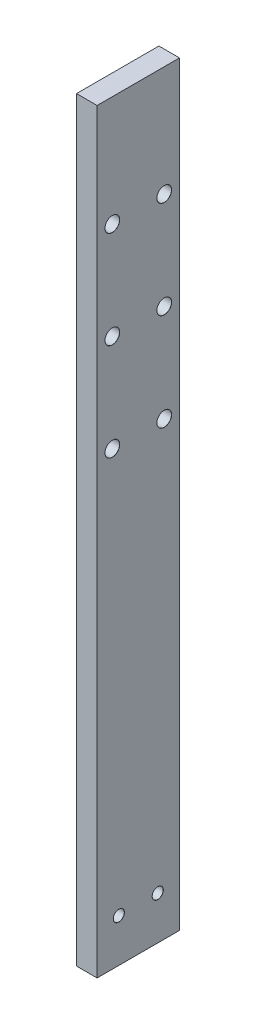
ISO-10303-21;
HEADER;
FILE_DESCRIPTION(('STEP AP214'),'2;1');
FILE_NAME('part.step','',(''),(''),'','','');
FILE_SCHEMA(('AUTOMOTIVE_DESIGN { 1 0 10303 214 1 1 1 1 }'));
ENDSEC;
DATA;
#1=APPLICATION_CONTEXT('core data for automotive mechanical design processes');
#2=APPLICATION_PROTOCOL_DEFINITION('international standard','automotive_design',2000,#1);
#3=PRODUCT_CONTEXT('',#1,'mechanical');
#4=PRODUCT('Part','Part','',(#3));
#5=PRODUCT_RELATED_PRODUCT_CATEGORY('part','',(#4));
#6=PRODUCT_DEFINITION_FORMATION('','',#4);
#7=PRODUCT_DEFINITION_CONTEXT('part definition',#1,'design');
#8=PRODUCT_DEFINITION('design','',#6,#7);
#9=PRODUCT_DEFINITION_SHAPE('','',#8);
#10=(LENGTH_UNIT() NAMED_UNIT(*) SI_UNIT(.MILLI.,.METRE.));
#11=(NAMED_UNIT(*) PLANE_ANGLE_UNIT() SI_UNIT($,.RADIAN.));
#12=(NAMED_UNIT(*) SI_UNIT($,.STERADIAN.) SOLID_ANGLE_UNIT());
#13=UNCERTAINTY_MEASURE_WITH_UNIT(LENGTH_MEASURE(1.E-05),#10,'distance_accuracy_value','');
#14=(GEOMETRIC_REPRESENTATION_CONTEXT(3) GLOBAL_UNCERTAINTY_ASSIGNED_CONTEXT((#13)) GLOBAL_UNIT_ASSIGNED_CONTEXT((#10,
#11,#12)) REPRESENTATION_CONTEXT('',''));
#15=CARTESIAN_POINT('',(0.,0.,0.));
#16=DIRECTION('',(0.,0.,1.));
#17=DIRECTION('',(1.,0.,0.));
#18=AXIS2_PLACEMENT_3D('',#15,#16,#17);
#19=CARTESIAN_POINT('',(6.35,0.,0.));
#20=DIRECTION('',(0.,0.,-1.));
#21=DIRECTION('',(0.,1.,0.));
#22=AXIS2_PLACEMENT_3D('',#19,#20,#21);
#23=PLANE('',#22);
#24=DIRECTION('',(0.,-1.,0.));
#25=VECTOR('',#24,1.);
#26=CARTESIAN_POINT('',(0.,0.,0.));
#27=LINE('',#26,#25);
#28=CARTESIAN_POINT('',(0.,232.968,0.));
#29=VERTEX_POINT('',#28);
#30=CARTESIAN_POINT('',(0.,0.,0.));
#31=VERTEX_POINT('',#30);
#32=EDGE_CURVE('E116',#29,#31,#27,.T.);
#33=ORIENTED_EDGE('',*,*,#32,.T.);
#34=DIRECTION('',(-1.,0.,0.));
#35=VECTOR('',#34,1.);
#36=CARTESIAN_POINT('',(6.35,0.,0.));
#37=LINE('',#36,#35);
#38=CARTESIAN_POINT('',(6.35,0.,0.));
#39=VERTEX_POINT('',#38);
#40=EDGE_CURVE('E11',#39,#31,#37,.T.);
#41=ORIENTED_EDGE('',*,*,#40,.F.);
#42=DIRECTION('',(0.,-1.,0.));
#43=VECTOR('',#42,1.);
#44=CARTESIAN_POINT('',(6.35,0.,0.));
#45=LINE('',#44,#43);
#46=CARTESIAN_POINT('',(6.35,232.968,0.));
#47=VERTEX_POINT('',#46);
#48=EDGE_CURVE('E99',#47,#39,#45,.T.);
#49=ORIENTED_EDGE('',*,*,#48,.F.);
#50=DIRECTION('',(-1.,0.,0.));
#51=VECTOR('',#50,1.);
#52=CARTESIAN_POINT('',(6.35,232.968,0.));
#53=LINE('',#52,#51);
#54=EDGE_CURVE('E112',#47,#29,#53,.T.);
#55=ORIENTED_EDGE('',*,*,#54,.T.);
#56=EDGE_LOOP('',(#33,#41,#49,#55));
#57=FACE_BOUND('',#56,.T.);
#58=ADVANCED_FACE('F45',(#57),#23,.F.);
#59=CARTESIAN_POINT('',(6.35,0.,0.));
#60=DIRECTION('',(0.,1.,0.));
#61=DIRECTION('',(0.,0.,1.));
#62=AXIS2_PLACEMENT_3D('',#59,#60,#61);
#63=PLANE('',#62);
#64=DIRECTION('',(0.,0.,-1.));
#65=VECTOR('',#64,1.);
#66=CARTESIAN_POINT('',(0.,0.,0.));
#67=LINE('',#66,#65);
#68=CARTESIAN_POINT('',(0.,0.,-25.4));
#69=VERTEX_POINT('',#68);
#70=EDGE_CURVE('E104',#31,#69,#67,.T.);
#71=ORIENTED_EDGE('',*,*,#70,.T.);
#72=DIRECTION('',(-1.,0.,0.));
#73=VECTOR('',#72,1.);
#74=CARTESIAN_POINT('',(6.35,0.,-25.4));
#75=LINE('',#74,#73);
#76=CARTESIAN_POINT('',(6.35,0.,-25.4));
#77=VERTEX_POINT('',#76);
#78=EDGE_CURVE('E55',#77,#69,#75,.T.);
#79=ORIENTED_EDGE('',*,*,#78,.F.);
#80=DIRECTION('',(0.,0.,-1.));
#81=VECTOR('',#80,1.);
#82=CARTESIAN_POINT('',(6.35,0.,0.));
#83=LINE('',#82,#81);
#84=EDGE_CURVE('E94',#39,#77,#83,.T.);
#85=ORIENTED_EDGE('',*,*,#84,.F.);
#86=ORIENTED_EDGE('',*,*,#40,.T.);
#87=EDGE_LOOP('',(#71,#79,#85,#86));
#88=FACE_BOUND('',#87,.T.);
#89=ADVANCED_FACE('F103',(#88),#63,.F.);
#90=CARTESIAN_POINT('',(6.35,0.,-25.4));
#91=DIRECTION('',(0.,0.,1.));
#92=DIRECTION('',(0.,-1.,0.));
#93=AXIS2_PLACEMENT_3D('',#90,#91,#92);
#94=PLANE('',#93);
#95=DIRECTION('',(0.,1.,0.));
#96=VECTOR('',#95,1.);
#97=CARTESIAN_POINT('',(0.,0.,-25.4));
#98=LINE('',#97,#96);
#99=CARTESIAN_POINT('',(0.,232.968,-25.4));
#100=VERTEX_POINT('',#99);
#101=EDGE_CURVE('E81',#69,#100,#98,.T.);
#102=ORIENTED_EDGE('',*,*,#101,.T.);
#103=DIRECTION('',(-1.,0.,0.));
#104=VECTOR('',#103,1.);
#105=CARTESIAN_POINT('',(6.35,232.968,-25.4));
#106=LINE('',#105,#104);
#107=CARTESIAN_POINT('',(6.35,232.968,-25.4));
#108=VERTEX_POINT('',#107);
#109=EDGE_CURVE('E106',#108,#100,#106,.T.);
#110=ORIENTED_EDGE('',*,*,#109,.F.);
#111=DIRECTION('',(0.,1.,0.));
#112=VECTOR('',#111,1.);
#113=CARTESIAN_POINT('',(6.35,0.,-25.4));
#114=LINE('',#113,#112);
#115=EDGE_CURVE('E97',#77,#108,#114,.T.);
#116=ORIENTED_EDGE('',*,*,#115,.F.);
#117=ORIENTED_EDGE('',*,*,#78,.T.);
#118=EDGE_LOOP('',(#102,#110,#116,#117));
#119=FACE_BOUND('',#118,.T.);
#120=ADVANCED_FACE('F108',(#119),#94,.F.);
#121=CARTESIAN_POINT('',(6.35,232.968,0.));
#122=DIRECTION('',(0.,-1.,0.));
#123=DIRECTION('',(0.,0.,-1.));
#124=AXIS2_PLACEMENT_3D('',#121,#122,#123);
#125=PLANE('',#124);
#126=DIRECTION('',(0.,0.,1.));
#127=VECTOR('',#126,1.);
#128=CARTESIAN_POINT('',(0.,232.968,0.));
#129=LINE('',#128,#127);
#130=EDGE_CURVE('E87',#100,#29,#129,.T.);
#131=ORIENTED_EDGE('',*,*,#130,.T.);
#132=ORIENTED_EDGE('',*,*,#54,.F.);
#133=DIRECTION('',(0.,0.,1.));
#134=VECTOR('',#133,1.);
#135=CARTESIAN_POINT('',(6.35,232.968,0.));
#136=LINE('',#135,#134);
#137=EDGE_CURVE('E64',#108,#47,#136,.T.);
#138=ORIENTED_EDGE('',*,*,#137,.F.);
#139=ORIENTED_EDGE('',*,*,#109,.T.);
#140=EDGE_LOOP('',(#131,#132,#138,#139));
#141=FACE_BOUND('',#140,.T.);
#142=ADVANCED_FACE('F231',(#141),#125,.F.);
#143=CARTESIAN_POINT('',(6.35,0.,0.));
#144=DIRECTION('',(-1.,0.,0.));
#145=DIRECTION('',(0.,0.,1.));
#146=AXIS2_PLACEMENT_3D('',#143,#144,#145);
#147=PLANE('',#146);
#148=CARTESIAN_POINT('',(6.35,198.968,-4.69999999999996));
#149=DIRECTION('',(1.,0.,0.));
#150=DIRECTION('',(0.,0.,-1.));
#151=AXIS2_PLACEMENT_3D('',#148,#149,#150);
#152=CIRCLE('',#151,2.275);
#153=CARTESIAN_POINT('',(6.35,198.968,-6.97499999999996));
#154=VERTEX_POINT('',#153);
#155=EDGE_CURVE('E495',#154,#154,#152,.T.);
#156=ORIENTED_EDGE('',*,*,#155,.F.);
#157=EDGE_LOOP('',(#156));
#158=FACE_BOUND('',#157,.T.);
#159=CARTESIAN_POINT('',(6.35,168.968,-4.69999999999996));
#160=DIRECTION('',(1.,0.,0.));
#161=DIRECTION('',(0.,0.,-1.));
#162=AXIS2_PLACEMENT_3D('',#159,#160,#161);
#163=CIRCLE('',#162,2.275);
#164=CARTESIAN_POINT('',(6.35,168.968,-6.97499999999996));
#165=VERTEX_POINT('',#164);
#166=EDGE_CURVE('E176',#165,#165,#163,.T.);
#167=ORIENTED_EDGE('',*,*,#166,.F.);
#168=EDGE_LOOP('',(#167));
#169=FACE_BOUND('',#168,.T.);
#170=CARTESIAN_POINT('',(6.35,138.968,-4.69999999999996));
#171=DIRECTION('',(1.,0.,0.));
#172=DIRECTION('',(0.,0.,-1.));
#173=AXIS2_PLACEMENT_3D('',#170,#171,#172);
#174=CIRCLE('',#173,2.275);
#175=CARTESIAN_POINT('',(6.35,138.968,-6.97499999999996));
#176=VERTEX_POINT('',#175);
#177=EDGE_CURVE('E167',#176,#176,#174,.T.);
#178=ORIENTED_EDGE('',*,*,#177,.F.);
#179=EDGE_LOOP('',(#178));
#180=FACE_BOUND('',#179,.T.);
#181=CARTESIAN_POINT('',(6.35,138.968,-20.7));
#182=DIRECTION('',(1.,0.,0.));
#183=DIRECTION('',(0.,0.,-1.));
#184=AXIS2_PLACEMENT_3D('',#181,#182,#183);
#185=CIRCLE('',#184,2.275);
#186=CARTESIAN_POINT('',(6.35,138.968,-22.975));
#187=VERTEX_POINT('',#186);
#188=EDGE_CURVE('E162',#187,#187,#185,.T.);
#189=ORIENTED_EDGE('',*,*,#188,.F.);
#190=EDGE_LOOP('',(#189));
#191=FACE_BOUND('',#190,.T.);
#192=CARTESIAN_POINT('',(6.35,168.968,-20.7));
#193=DIRECTION('',(1.,0.,0.));
#194=DIRECTION('',(0.,0.,-1.));
#195=AXIS2_PLACEMENT_3D('',#192,#193,#194);
#196=CIRCLE('',#195,2.275);
#197=CARTESIAN_POINT('',(6.35,168.968,-22.975));
#198=VERTEX_POINT('',#197);
#199=EDGE_CURVE('E157',#198,#198,#196,.T.);
#200=ORIENTED_EDGE('',*,*,#199,.F.);
#201=EDGE_LOOP('',(#200));
#202=FACE_BOUND('',#201,.T.);
#203=CARTESIAN_POINT('',(6.35,198.968,-20.7));
#204=DIRECTION('',(1.,0.,0.));
#205=DIRECTION('',(0.,0.,-1.));
#206=AXIS2_PLACEMENT_3D('',#203,#204,#205);
#207=CIRCLE('',#206,2.275);
#208=CARTESIAN_POINT('',(6.35,198.968,-22.975));
#209=VERTEX_POINT('',#208);
#210=EDGE_CURVE('E151',#209,#209,#207,.T.);
#211=ORIENTED_EDGE('',*,*,#210,.F.);
#212=EDGE_LOOP('',(#211));
#213=FACE_BOUND('',#212,.T.);
#214=CARTESIAN_POINT('',(6.35,13.3,-6.7));
#215=DIRECTION('',(1.,0.,0.));
#216=DIRECTION('',(0.,0.,-1.));
#217=AXIS2_PLACEMENT_3D('',#214,#215,#216);
#218=CIRCLE('',#217,1.725);
#219=CARTESIAN_POINT('',(6.35,13.3,-8.425));
#220=VERTEX_POINT('',#219);
#221=EDGE_CURVE('E145',#220,#220,#218,.T.);
#222=ORIENTED_EDGE('',*,*,#221,.F.);
#223=EDGE_LOOP('',(#222));
#224=FACE_BOUND('',#223,.T.);
#225=CARTESIAN_POINT('',(6.35,13.3,-18.7));
#226=DIRECTION('',(1.,0.,0.));
#227=DIRECTION('',(0.,0.,-1.));
#228=AXIS2_PLACEMENT_3D('',#225,#226,#227);
#229=CIRCLE('',#228,1.725);
#230=CARTESIAN_POINT('',(6.35,13.3,-20.425));
#231=VERTEX_POINT('',#230);
#232=EDGE_CURVE('E139',#231,#231,#229,.T.);
#233=ORIENTED_EDGE('',*,*,#232,.F.);
#234=EDGE_LOOP('',(#233));
#235=FACE_BOUND('',#234,.T.);
#236=ORIENTED_EDGE('',*,*,#48,.T.);
#237=ORIENTED_EDGE('',*,*,#84,.T.);
#238=ORIENTED_EDGE('',*,*,#115,.T.);
#239=ORIENTED_EDGE('',*,*,#137,.T.);
#240=EDGE_LOOP('',(#236,#237,#238,#239));
#241=FACE_BOUND('',#240,.T.);
#242=ADVANCED_FACE('F95',(#158,#169,#180,#191,#202,#213,#224,#235,#241),#147,.F.);
#243=CARTESIAN_POINT('',(0.,0.,0.));
#244=DIRECTION('',(-1.,0.,0.));
#245=DIRECTION('',(0.,0.,1.));
#246=AXIS2_PLACEMENT_3D('',#243,#244,#245);
#247=PLANE('',#246);
#248=CARTESIAN_POINT('',(0.,198.968,-4.69999999999996));
#249=DIRECTION('',(-1.,0.,0.));
#250=DIRECTION('',(0.,0.,1.));
#251=AXIS2_PLACEMENT_3D('',#248,#249,#250);
#252=CIRCLE('',#251,2.25);
#253=CARTESIAN_POINT('',(0.,198.968,-2.44999999999996));
#254=VERTEX_POINT('',#253);
#255=EDGE_CURVE('E48',#254,#254,#252,.T.);
#256=ORIENTED_EDGE('',*,*,#255,.F.);
#257=EDGE_LOOP('',(#256));
#258=FACE_BOUND('',#257,.T.);
#259=CARTESIAN_POINT('',(0.,168.968,-4.69999999999996));
#260=DIRECTION('',(-1.,0.,0.));
#261=DIRECTION('',(0.,0.,1.));
#262=AXIS2_PLACEMENT_3D('',#259,#260,#261);
#263=CIRCLE('',#262,2.25);
#264=CARTESIAN_POINT('',(0.,168.968,-2.44999999999996));
#265=VERTEX_POINT('',#264);
#266=EDGE_CURVE('E164',#265,#265,#263,.T.);
#267=ORIENTED_EDGE('',*,*,#266,.F.);
#268=EDGE_LOOP('',(#267));
#269=FACE_BOUND('',#268,.T.);
#270=CARTESIAN_POINT('',(0.,138.968,-4.69999999999996));
#271=DIRECTION('',(-1.,0.,0.));
#272=DIRECTION('',(0.,0.,1.));
#273=AXIS2_PLACEMENT_3D('',#270,#271,#272);
#274=CIRCLE('',#273,2.25);
#275=CARTESIAN_POINT('',(0.,138.968,-2.44999999999996));
#276=VERTEX_POINT('',#275);
#277=EDGE_CURVE('E159',#276,#276,#274,.T.);
#278=ORIENTED_EDGE('',*,*,#277,.F.);
#279=EDGE_LOOP('',(#278));
#280=FACE_BOUND('',#279,.T.);
#281=CARTESIAN_POINT('',(0.,138.968,-20.7));
#282=DIRECTION('',(-1.,0.,0.));
#283=DIRECTION('',(0.,0.,1.));
#284=AXIS2_PLACEMENT_3D('',#281,#282,#283);
#285=CIRCLE('',#284,2.25);
#286=CARTESIAN_POINT('',(0.,138.968,-18.45));
#287=VERTEX_POINT('',#286);
#288=EDGE_CURVE('E153',#287,#287,#285,.T.);
#289=ORIENTED_EDGE('',*,*,#288,.F.);
#290=EDGE_LOOP('',(#289));
#291=FACE_BOUND('',#290,.T.);
#292=CARTESIAN_POINT('',(0.,168.968,-20.7));
#293=DIRECTION('',(-1.,0.,0.));
#294=DIRECTION('',(0.,0.,1.));
#295=AXIS2_PLACEMENT_3D('',#292,#293,#294);
#296=CIRCLE('',#295,2.25);
#297=CARTESIAN_POINT('',(0.,168.968,-18.45));
#298=VERTEX_POINT('',#297);
#299=EDGE_CURVE('E147',#298,#298,#296,.T.);
#300=ORIENTED_EDGE('',*,*,#299,.F.);
#301=EDGE_LOOP('',(#300));
#302=FACE_BOUND('',#301,.T.);
#303=CARTESIAN_POINT('',(0.,198.968,-20.7));
#304=DIRECTION('',(-1.,0.,0.));
#305=DIRECTION('',(0.,0.,1.));
#306=AXIS2_PLACEMENT_3D('',#303,#304,#305);
#307=CIRCLE('',#306,2.25);
#308=CARTESIAN_POINT('',(0.,198.968,-18.45));
#309=VERTEX_POINT('',#308);
#310=EDGE_CURVE('E141',#309,#309,#307,.T.);
#311=ORIENTED_EDGE('',*,*,#310,.F.);
#312=EDGE_LOOP('',(#311));
#313=FACE_BOUND('',#312,.T.);
#314=CARTESIAN_POINT('',(0.,13.3,-6.7));
#315=DIRECTION('',(-1.,0.,0.));
#316=DIRECTION('',(0.,0.,1.));
#317=AXIS2_PLACEMENT_3D('',#314,#315,#316);
#318=CIRCLE('',#317,1.7);
#319=CARTESIAN_POINT('',(0.,13.3,-5.));
#320=VERTEX_POINT('',#319);
#321=EDGE_CURVE('E135',#320,#320,#318,.T.);
#322=ORIENTED_EDGE('',*,*,#321,.F.);
#323=EDGE_LOOP('',(#322));
#324=FACE_BOUND('',#323,.T.);
#325=CARTESIAN_POINT('',(0.,13.3,-18.7));
#326=DIRECTION('',(-1.,0.,0.));
#327=DIRECTION('',(0.,0.,1.));
#328=AXIS2_PLACEMENT_3D('',#325,#326,#327);
#329=CIRCLE('',#328,1.7);
#330=CARTESIAN_POINT('',(0.,13.3,-17.));
#331=VERTEX_POINT('',#330);
#332=EDGE_CURVE('E120',#331,#331,#329,.T.);
#333=ORIENTED_EDGE('',*,*,#332,.F.);
#334=EDGE_LOOP('',(#333));
#335=FACE_BOUND('',#334,.T.);
#336=ORIENTED_EDGE('',*,*,#32,.F.);
#337=ORIENTED_EDGE('',*,*,#130,.F.);
#338=ORIENTED_EDGE('',*,*,#101,.F.);
#339=ORIENTED_EDGE('',*,*,#70,.F.);
#340=EDGE_LOOP('',(#336,#337,#338,#339));
#341=FACE_BOUND('',#340,.T.);
#342=ADVANCED_FACE('F230',(#258,#269,#280,#291,#302,#313,#324,#335,#341),#247,.T.);
#343=CARTESIAN_POINT('',(6.35,13.3,-18.7));
#344=DIRECTION('',(1.,0.,0.));
#345=DIRECTION('',(0.,0.,-1.));
#346=AXIS2_PLACEMENT_3D('',#343,#344,#345);
#347=CYLINDRICAL_SURFACE('',#346,1.7);
#348=ORIENTED_EDGE('',*,*,#332,.T.);
#349=EDGE_LOOP('',(#348));
#350=FACE_BOUND('',#349,.T.);
#351=CARTESIAN_POINT('',(6.32902250922057,13.3,-18.7));
#352=DIRECTION('',(1.,0.,0.));
#353=DIRECTION('',(0.,0.,-1.));
#354=AXIS2_PLACEMENT_3D('',#351,#352,#353);
#355=CIRCLE('',#354,1.7);
#356=CARTESIAN_POINT('',(6.32902250922057,13.3,-20.4));
#357=VERTEX_POINT('',#356);
#358=EDGE_CURVE('E134',#357,#357,#355,.T.);
#359=ORIENTED_EDGE('',*,*,#358,.T.);
#360=EDGE_LOOP('',(#359));
#361=FACE_BOUND('',#360,.T.);
#362=ADVANCED_FACE('F220',(#350,#361),#347,.F.);
#363=CARTESIAN_POINT('',(6.35,13.3,-18.7));
#364=DIRECTION('',(1.,0.,0.));
#365=DIRECTION('',(0.,0.,-1.));
#366=AXIS2_PLACEMENT_3D('',#363,#364,#365);
#367=CONICAL_SURFACE('',#366,1.725,0.872664625997213);
#368=ORIENTED_EDGE('',*,*,#358,.F.);
#369=EDGE_LOOP('',(#368));
#370=FACE_BOUND('',#369,.T.);
#371=ORIENTED_EDGE('',*,*,#232,.T.);
#372=EDGE_LOOP('',(#371));
#373=FACE_BOUND('',#372,.T.);
#374=ADVANCED_FACE('F222',(#370,#373),#367,.F.);
#375=CARTESIAN_POINT('',(6.35,13.3,-6.7));
#376=DIRECTION('',(1.,0.,0.));
#377=DIRECTION('',(0.,0.,-1.));
#378=AXIS2_PLACEMENT_3D('',#375,#376,#377);
#379=CYLINDRICAL_SURFACE('',#378,1.7);
#380=ORIENTED_EDGE('',*,*,#321,.T.);
#381=EDGE_LOOP('',(#380));
#382=FACE_BOUND('',#381,.T.);
#383=CARTESIAN_POINT('',(6.32902250922057,13.3,-6.7));
#384=DIRECTION('',(1.,0.,0.));
#385=DIRECTION('',(0.,0.,-1.));
#386=AXIS2_PLACEMENT_3D('',#383,#384,#385);
#387=CIRCLE('',#386,1.7);
#388=CARTESIAN_POINT('',(6.32902250922057,13.3,-8.4));
#389=VERTEX_POINT('',#388);
#390=EDGE_CURVE('E140',#389,#389,#387,.T.);
#391=ORIENTED_EDGE('',*,*,#390,.T.);
#392=EDGE_LOOP('',(#391));
#393=FACE_BOUND('',#392,.T.);
#394=ADVANCED_FACE('F225',(#382,#393),#379,.F.);
#395=CARTESIAN_POINT('',(6.35,13.3,-6.7));
#396=DIRECTION('',(1.,0.,0.));
#397=DIRECTION('',(0.,0.,-1.));
#398=AXIS2_PLACEMENT_3D('',#395,#396,#397);
#399=CONICAL_SURFACE('',#398,1.725,0.872664625997213);
#400=ORIENTED_EDGE('',*,*,#390,.F.);
#401=EDGE_LOOP('',(#400));
#402=FACE_BOUND('',#401,.T.);
#403=ORIENTED_EDGE('',*,*,#221,.T.);
#404=EDGE_LOOP('',(#403));
#405=FACE_BOUND('',#404,.T.);
#406=ADVANCED_FACE('F292',(#402,#405),#399,.F.);
#407=CARTESIAN_POINT('',(6.35,198.968,-20.7));
#408=DIRECTION('',(1.,0.,0.));
#409=DIRECTION('',(0.,0.,-1.));
#410=AXIS2_PLACEMENT_3D('',#407,#408,#409);
#411=CYLINDRICAL_SURFACE('',#410,2.25);
#412=ORIENTED_EDGE('',*,*,#310,.T.);
#413=EDGE_LOOP('',(#412));
#414=FACE_BOUND('',#413,.T.);
#415=CARTESIAN_POINT('',(6.32902250922057,198.968,-20.7));
#416=DIRECTION('',(1.,0.,0.));
#417=DIRECTION('',(0.,0.,-1.));
#418=AXIS2_PLACEMENT_3D('',#415,#416,#417);
#419=CIRCLE('',#418,2.25);
#420=CARTESIAN_POINT('',(6.32902250922057,198.968,-22.95));
#421=VERTEX_POINT('',#420);
#422=EDGE_CURVE('E146',#421,#421,#419,.T.);
#423=ORIENTED_EDGE('',*,*,#422,.T.);
#424=EDGE_LOOP('',(#423));
#425=FACE_BOUND('',#424,.T.);
#426=ADVANCED_FACE('F302',(#414,#425),#411,.F.);
#427=CARTESIAN_POINT('',(6.35,198.968,-20.7));
#428=DIRECTION('',(1.,0.,0.));
#429=DIRECTION('',(0.,0.,-1.));
#430=AXIS2_PLACEMENT_3D('',#427,#428,#429);
#431=CONICAL_SURFACE('',#430,2.275,0.87266462599705);
#432=ORIENTED_EDGE('',*,*,#422,.F.);
#433=EDGE_LOOP('',(#432));
#434=FACE_BOUND('',#433,.T.);
#435=ORIENTED_EDGE('',*,*,#210,.T.);
#436=EDGE_LOOP('',(#435));
#437=FACE_BOUND('',#436,.T.);
#438=ADVANCED_FACE('F325',(#434,#437),#431,.F.);
#439=CARTESIAN_POINT('',(6.35,168.968,-20.7));
#440=DIRECTION('',(1.,0.,0.));
#441=DIRECTION('',(0.,0.,-1.));
#442=AXIS2_PLACEMENT_3D('',#439,#440,#441);
#443=CYLINDRICAL_SURFACE('',#442,2.25);
#444=ORIENTED_EDGE('',*,*,#299,.T.);
#445=EDGE_LOOP('',(#444));
#446=FACE_BOUND('',#445,.T.);
#447=CARTESIAN_POINT('',(6.32902250922057,168.968,-20.7));
#448=DIRECTION('',(1.,0.,0.));
#449=DIRECTION('',(0.,0.,-1.));
#450=AXIS2_PLACEMENT_3D('',#447,#448,#449);
#451=CIRCLE('',#450,2.25);
#452=CARTESIAN_POINT('',(6.32902250922057,168.968,-22.95));
#453=VERTEX_POINT('',#452);
#454=EDGE_CURVE('E152',#453,#453,#451,.T.);
#455=ORIENTED_EDGE('',*,*,#454,.T.);
#456=EDGE_LOOP('',(#455));
#457=FACE_BOUND('',#456,.T.);
#458=ADVANCED_FACE('F337',(#446,#457),#443,.F.);
#459=CARTESIAN_POINT('',(6.35,168.968,-20.7));
#460=DIRECTION('',(1.,0.,0.));
#461=DIRECTION('',(0.,0.,-1.));
#462=AXIS2_PLACEMENT_3D('',#459,#460,#461);
#463=CONICAL_SURFACE('',#462,2.275,0.87266462599705);
#464=ORIENTED_EDGE('',*,*,#454,.F.);
#465=EDGE_LOOP('',(#464));
#466=FACE_BOUND('',#465,.T.);
#467=ORIENTED_EDGE('',*,*,#199,.T.);
#468=EDGE_LOOP('',(#467));
#469=FACE_BOUND('',#468,.T.);
#470=ADVANCED_FACE('F348',(#466,#469),#463,.F.);
#471=CARTESIAN_POINT('',(6.35,138.968,-20.7));
#472=DIRECTION('',(1.,0.,0.));
#473=DIRECTION('',(0.,0.,-1.));
#474=AXIS2_PLACEMENT_3D('',#471,#472,#473);
#475=CYLINDRICAL_SURFACE('',#474,2.25);
#476=ORIENTED_EDGE('',*,*,#288,.T.);
#477=EDGE_LOOP('',(#476));
#478=FACE_BOUND('',#477,.T.);
#479=CARTESIAN_POINT('',(6.32902250922057,138.968,-20.7));
#480=DIRECTION('',(1.,0.,0.));
#481=DIRECTION('',(0.,0.,-1.));
#482=AXIS2_PLACEMENT_3D('',#479,#480,#481);
#483=CIRCLE('',#482,2.25);
#484=CARTESIAN_POINT('',(6.32902250922057,138.968,-22.95));
#485=VERTEX_POINT('',#484);
#486=EDGE_CURVE('E158',#485,#485,#483,.T.);
#487=ORIENTED_EDGE('',*,*,#486,.T.);
#488=EDGE_LOOP('',(#487));
#489=FACE_BOUND('',#488,.T.);
#490=ADVANCED_FACE('F360',(#478,#489),#475,.F.);
#491=CARTESIAN_POINT('',(6.35,138.968,-20.7));
#492=DIRECTION('',(1.,0.,0.));
#493=DIRECTION('',(0.,0.,-1.));
#494=AXIS2_PLACEMENT_3D('',#491,#492,#493);
#495=CONICAL_SURFACE('',#494,2.275,0.87266462599705);
#496=ORIENTED_EDGE('',*,*,#486,.F.);
#497=EDGE_LOOP('',(#496));
#498=FACE_BOUND('',#497,.T.);
#499=ORIENTED_EDGE('',*,*,#188,.T.);
#500=EDGE_LOOP('',(#499));
#501=FACE_BOUND('',#500,.T.);
#502=ADVANCED_FACE('F371',(#498,#501),#495,.F.);
#503=CARTESIAN_POINT('',(6.35,138.968,-4.69999999999996));
#504=DIRECTION('',(1.,0.,0.));
#505=DIRECTION('',(0.,0.,-1.));
#506=AXIS2_PLACEMENT_3D('',#503,#504,#505);
#507=CYLINDRICAL_SURFACE('',#506,2.25);
#508=ORIENTED_EDGE('',*,*,#277,.T.);
#509=EDGE_LOOP('',(#508));
#510=FACE_BOUND('',#509,.T.);
#511=CARTESIAN_POINT('',(6.32902250922057,138.968,-4.69999999999996));
#512=DIRECTION('',(1.,0.,0.));
#513=DIRECTION('',(0.,0.,-1.));
#514=AXIS2_PLACEMENT_3D('',#511,#512,#513);
#515=CIRCLE('',#514,2.25);
#516=CARTESIAN_POINT('',(6.32902250922057,138.968,-6.94999999999996));
#517=VERTEX_POINT('',#516);
#518=EDGE_CURVE('E163',#517,#517,#515,.T.);
#519=ORIENTED_EDGE('',*,*,#518,.T.);
#520=EDGE_LOOP('',(#519));
#521=FACE_BOUND('',#520,.T.);
#522=ADVANCED_FACE('F383',(#510,#521),#507,.F.);
#523=CARTESIAN_POINT('',(6.35,138.968,-4.69999999999996));
#524=DIRECTION('',(1.,0.,0.));
#525=DIRECTION('',(0.,0.,-1.));
#526=AXIS2_PLACEMENT_3D('',#523,#524,#525);
#527=CONICAL_SURFACE('',#526,2.275,0.87266462599705);
#528=ORIENTED_EDGE('',*,*,#518,.F.);
#529=EDGE_LOOP('',(#528));
#530=FACE_BOUND('',#529,.T.);
#531=ORIENTED_EDGE('',*,*,#177,.T.);
#532=EDGE_LOOP('',(#531));
#533=FACE_BOUND('',#532,.T.);
#534=ADVANCED_FACE('F394',(#530,#533),#527,.F.);
#535=CARTESIAN_POINT('',(6.35,168.968,-4.69999999999996));
#536=DIRECTION('',(1.,0.,0.));
#537=DIRECTION('',(0.,0.,-1.));
#538=AXIS2_PLACEMENT_3D('',#535,#536,#537);
#539=CYLINDRICAL_SURFACE('',#538,2.25);
#540=ORIENTED_EDGE('',*,*,#266,.T.);
#541=EDGE_LOOP('',(#540));
#542=FACE_BOUND('',#541,.T.);
#543=CARTESIAN_POINT('',(6.32902250922057,168.968,-4.69999999999996));
#544=DIRECTION('',(1.,0.,0.));
#545=DIRECTION('',(0.,0.,-1.));
#546=AXIS2_PLACEMENT_3D('',#543,#544,#545);
#547=CIRCLE('',#546,2.25);
#548=CARTESIAN_POINT('',(6.32902250922057,168.968,-6.94999999999996));
#549=VERTEX_POINT('',#548);
#550=EDGE_CURVE('E168',#549,#549,#547,.T.);
#551=ORIENTED_EDGE('',*,*,#550,.T.);
#552=EDGE_LOOP('',(#551));
#553=FACE_BOUND('',#552,.T.);
#554=ADVANCED_FACE('F406',(#542,#553),#539,.F.);
#555=CARTESIAN_POINT('',(6.35,168.968,-4.69999999999996));
#556=DIRECTION('',(1.,0.,0.));
#557=DIRECTION('',(0.,0.,-1.));
#558=AXIS2_PLACEMENT_3D('',#555,#556,#557);
#559=CONICAL_SURFACE('',#558,2.275,0.87266462599705);
#560=ORIENTED_EDGE('',*,*,#550,.F.);
#561=EDGE_LOOP('',(#560));
#562=FACE_BOUND('',#561,.T.);
#563=ORIENTED_EDGE('',*,*,#166,.T.);
#564=EDGE_LOOP('',(#563));
#565=FACE_BOUND('',#564,.T.);
#566=ADVANCED_FACE('F417',(#562,#565),#559,.F.);
#567=CARTESIAN_POINT('',(6.35,198.968,-4.69999999999996));
#568=DIRECTION('',(1.,0.,0.));
#569=DIRECTION('',(0.,0.,-1.));
#570=AXIS2_PLACEMENT_3D('',#567,#568,#569);
#571=CYLINDRICAL_SURFACE('',#570,2.25);
#572=ORIENTED_EDGE('',*,*,#255,.T.);
#573=EDGE_LOOP('',(#572));
#574=FACE_BOUND('',#573,.T.);
#575=CARTESIAN_POINT('',(6.32902250922057,198.968,-4.69999999999996));
#576=DIRECTION('',(1.,0.,0.));
#577=DIRECTION('',(0.,0.,-1.));
#578=AXIS2_PLACEMENT_3D('',#575,#576,#577);
#579=CIRCLE('',#578,2.25);
#580=CARTESIAN_POINT('',(6.32902250922057,198.968,-6.94999999999996));
#581=VERTEX_POINT('',#580);
#582=EDGE_CURVE('E493',#581,#581,#579,.T.);
#583=ORIENTED_EDGE('',*,*,#582,.T.);
#584=EDGE_LOOP('',(#583));
#585=FACE_BOUND('',#584,.T.);
#586=ADVANCED_FACE('F427',(#574,#585),#571,.F.);
#587=CARTESIAN_POINT('',(6.35,198.968,-4.69999999999996));
#588=DIRECTION('',(1.,0.,0.));
#589=DIRECTION('',(0.,0.,-1.));
#590=AXIS2_PLACEMENT_3D('',#587,#588,#589);
#591=CONICAL_SURFACE('',#590,2.275,0.87266462599705);
#592=ORIENTED_EDGE('',*,*,#582,.F.);
#593=EDGE_LOOP('',(#592));
#594=FACE_BOUND('',#593,.T.);
#595=ORIENTED_EDGE('',*,*,#155,.T.);
#596=EDGE_LOOP('',(#595));
#597=FACE_BOUND('',#596,.T.);
#598=ADVANCED_FACE('F438',(#594,#597),#591,.F.);
#599=CLOSED_SHELL('',(#58,#89,#120,#142,#242,#342,#362,#374,#394,#406,#426,#438,#458,#470,#490,
#502,#522,#534,#554,#566,#586,#598));
#600=MANIFOLD_SOLID_BREP('B2',#599);
#601=ADVANCED_BREP_SHAPE_REPRESENTATION('',(#18,#600),#14);
#602=SHAPE_DEFINITION_REPRESENTATION(#9,#601);
ENDSEC;
END-ISO-10303-21;
